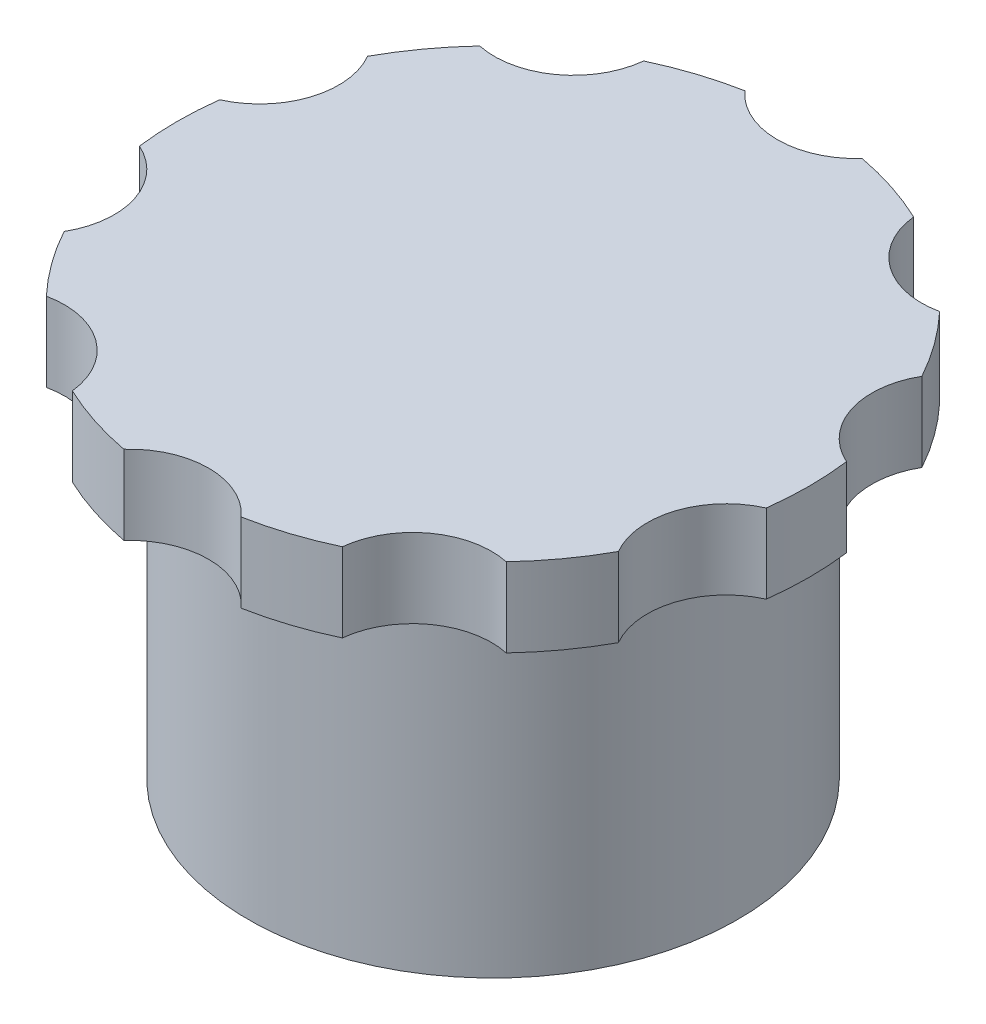
ISO-10303-21;
HEADER;
FILE_DESCRIPTION(('STEP AP214'),'2;1');
FILE_NAME('part.step','',(''),(''),'','','');
FILE_SCHEMA(('AUTOMOTIVE_DESIGN { 1 0 10303 214 1 1 1 1 }'));
ENDSEC;
DATA;
#1=APPLICATION_CONTEXT('core data for automotive mechanical design processes');
#2=APPLICATION_PROTOCOL_DEFINITION('international standard','automotive_design',2000,#1);
#3=PRODUCT_CONTEXT('',#1,'mechanical');
#4=PRODUCT('Part','Part','',(#3));
#5=PRODUCT_RELATED_PRODUCT_CATEGORY('part','',(#4));
#6=PRODUCT_DEFINITION_FORMATION('','',#4);
#7=PRODUCT_DEFINITION_CONTEXT('part definition',#1,'design');
#8=PRODUCT_DEFINITION('design','',#6,#7);
#9=PRODUCT_DEFINITION_SHAPE('','',#8);
#10=(LENGTH_UNIT() NAMED_UNIT(*) SI_UNIT(.MILLI.,.METRE.));
#11=(NAMED_UNIT(*) PLANE_ANGLE_UNIT() SI_UNIT($,.RADIAN.));
#12=(NAMED_UNIT(*) SI_UNIT($,.STERADIAN.) SOLID_ANGLE_UNIT());
#13=UNCERTAINTY_MEASURE_WITH_UNIT(LENGTH_MEASURE(1.E-05),#10,'distance_accuracy_value','');
#14=(GEOMETRIC_REPRESENTATION_CONTEXT(3) GLOBAL_UNCERTAINTY_ASSIGNED_CONTEXT((#13)) GLOBAL_UNIT_ASSIGNED_CONTEXT((#10,
#11,#12)) REPRESENTATION_CONTEXT('',''));
#15=CARTESIAN_POINT('',(0.,0.,0.));
#16=DIRECTION('',(0.,0.,1.));
#17=DIRECTION('',(1.,0.,0.));
#18=AXIS2_PLACEMENT_3D('',#15,#16,#17);
#19=CARTESIAN_POINT('',(0.,21.,0.));
#20=DIRECTION('',(0.,1.,0.));
#21=DIRECTION('',(0.,0.,1.));
#22=AXIS2_PLACEMENT_3D('',#19,#20,#21);
#23=PLANE('',#22);
#24=CARTESIAN_POINT('',(0.,21.,0.));
#25=DIRECTION('',(0.,1.,0.));
#26=DIRECTION('',(0.,0.,1.));
#27=AXIS2_PLACEMENT_3D('',#24,#25,#26);
#28=CIRCLE('',#27,15.5);
#29=CARTESIAN_POINT('',(0.,21.,-15.5));
#30=VERTEX_POINT('',#29);
#31=EDGE_CURVE('E230',#30,#30,#28,.T.);
#32=ORIENTED_EDGE('',*,*,#31,.T.);
#33=EDGE_LOOP('',(#32));
#34=FACE_BOUND('',#33,.T.);
#35=CARTESIAN_POINT('',(0.,21.,0.));
#36=DIRECTION('',(0.,1.,0.));
#37=DIRECTION('',(0.,0.,1.));
#38=AXIS2_PLACEMENT_3D('',#35,#36,#37);
#39=CIRCLE('',#38,20.);
#40=CARTESIAN_POINT('',(3.71376634854066,21.,19.652173913042));
#41=VERTEX_POINT('',#40);
#42=CARTESIAN_POINT('',(8.54675791246722,21.,18.0818397621945));
#43=VERTEX_POINT('',#42);
#44=EDGE_CURVE('E171',#41,#43,#39,.T.);
#45=ORIENTED_EDGE('',*,*,#44,.F.);
#46=CARTESIAN_POINT('',(0.,21.,23.));
#47=DIRECTION('',(0.,1.,0.));
#48=DIRECTION('',(0.,0.,1.));
#49=AXIS2_PLACEMENT_3D('',#46,#47,#48);
#50=CIRCLE('',#49,5.00000000000698);
#51=CARTESIAN_POINT('',(-3.71376634854066,21.,19.652173913042));
#52=VERTEX_POINT('',#51);
#53=EDGE_CURVE('E186',#41,#52,#50,.T.);
#54=ORIENTED_EDGE('',*,*,#53,.T.);
#55=CARTESIAN_POINT('',(-8.5467579124647,21.,18.0818397621957));
#56=VERTEX_POINT('',#55);
#57=EDGE_CURVE('E193',#56,#52,#39,.T.);
#58=ORIENTED_EDGE('',*,*,#57,.F.);
#59=CARTESIAN_POINT('',(-13.5190608027269,21.,18.6073908706238));
#60=DIRECTION('',(0.,1.,0.));
#61=DIRECTION('',(0.,0.,1.));
#62=AXIS2_PLACEMENT_3D('',#59,#60,#61);
#63=CIRCLE('',#62,5.00000000000796);
#64=CARTESIAN_POINT('',(-14.5557580906809,21.,13.7160455819299));
#65=VERTEX_POINT('',#64);
#66=EDGE_CURVE('E201',#56,#65,#63,.T.);
#67=ORIENTED_EDGE('',*,*,#66,.T.);
#68=CARTESIAN_POINT('',(-17.5427111445265,21.,9.60485740132067));
#69=VERTEX_POINT('',#68);
#70=EDGE_CURVE('E355',#69,#65,#39,.T.);
#71=ORIENTED_EDGE('',*,*,#70,.F.);
#72=CARTESIAN_POINT('',(-21.8742998747885,21.,7.10739087062379));
#73=DIRECTION('',(0.,1.,0.));
#74=DIRECTION('',(0.,0.,1.));
#75=AXIS2_PLACEMENT_3D('',#72,#73,#74);
#76=CIRCLE('',#75,5.00000000000838);
#77=CARTESIAN_POINT('',(-19.8379449742012,21.,2.5408540297631));
#78=VERTEX_POINT('',#77);
#79=EDGE_CURVE('E279',#69,#78,#76,.T.);
#80=ORIENTED_EDGE('',*,*,#79,.T.);
#81=CARTESIAN_POINT('',(-19.8379449742012,21.,-2.54085402976331));
#82=VERTEX_POINT('',#81);
#83=EDGE_CURVE('E268',#82,#78,#39,.T.);
#84=ORIENTED_EDGE('',*,*,#83,.F.);
#85=CARTESIAN_POINT('',(-21.8742998747885,21.,-7.10739087062379));
#86=DIRECTION('',(0.,1.,0.));
#87=DIRECTION('',(0.,0.,1.));
#88=AXIS2_PLACEMENT_3D('',#85,#86,#87);
#89=CIRCLE('',#88,5.00000000000819);
#90=CARTESIAN_POINT('',(-17.5427111445266,21.,-9.60485740132047));
#91=VERTEX_POINT('',#90);
#92=EDGE_CURVE('E266',#82,#91,#89,.T.);
#93=ORIENTED_EDGE('',*,*,#92,.T.);
#94=CARTESIAN_POINT('',(-14.5557580906807,21.,-13.7160455819301));
#95=VERTEX_POINT('',#94);
#96=EDGE_CURVE('E253',#95,#91,#39,.T.);
#97=ORIENTED_EDGE('',*,*,#96,.F.);
#98=CARTESIAN_POINT('',(-13.5190608027269,21.,-18.6073908706238));
#99=DIRECTION('',(0.,1.,0.));
#100=DIRECTION('',(0.,0.,1.));
#101=AXIS2_PLACEMENT_3D('',#98,#99,#100);
#102=CIRCLE('',#101,5.00000000000768);
#103=CARTESIAN_POINT('',(-8.54675791246501,21.,-18.0818397621956));
#104=VERTEX_POINT('',#103);
#105=EDGE_CURVE('E263',#95,#104,#102,.T.);
#106=ORIENTED_EDGE('',*,*,#105,.T.);
#107=CARTESIAN_POINT('',(-3.71376634853263,21.,-19.6521739130435));
#108=VERTEX_POINT('',#107);
#109=EDGE_CURVE('E267',#108,#104,#39,.T.);
#110=ORIENTED_EDGE('',*,*,#109,.F.);
#111=CARTESIAN_POINT('',(0.,21.,-23.));
#112=DIRECTION('',(0.,1.,0.));
#113=DIRECTION('',(0.,0.,1.));
#114=AXIS2_PLACEMENT_3D('',#111,#112,#113);
#115=CIRCLE('',#114,5.);
#116=CARTESIAN_POINT('',(3.71376634853263,21.,-19.6521739130435));
#117=VERTEX_POINT('',#116);
#118=EDGE_CURVE('E220',#108,#117,#115,.T.);
#119=ORIENTED_EDGE('',*,*,#118,.T.);
#120=CARTESIAN_POINT('',(8.54675791247195,21.,-18.0818397621923));
#121=VERTEX_POINT('',#120);
#122=EDGE_CURVE('E341',#121,#117,#39,.T.);
#123=ORIENTED_EDGE('',*,*,#122,.F.);
#124=CARTESIAN_POINT('',(13.5190608027269,21.,-18.6073908706238));
#125=DIRECTION('',(0.,1.,0.));
#126=DIRECTION('',(0.,0.,1.));
#127=AXIS2_PLACEMENT_3D('',#124,#125,#126);
#128=CIRCLE('',#127,5.00000000000111);
#129=CARTESIAN_POINT('',(14.5557580906754,21.,-13.7160455819357));
#130=VERTEX_POINT('',#129);
#131=EDGE_CURVE('E217',#121,#130,#128,.T.);
#132=ORIENTED_EDGE('',*,*,#131,.T.);
#133=CARTESIAN_POINT('',(17.5427111445299,21.,-9.60485740131454));
#134=VERTEX_POINT('',#133);
#135=EDGE_CURVE('E544',#134,#130,#39,.T.);
#136=ORIENTED_EDGE('',*,*,#135,.F.);
#137=CARTESIAN_POINT('',(21.8742998747885,21.,-7.10739087062379));
#138=DIRECTION('',(0.,1.,0.));
#139=DIRECTION('',(0.,0.,1.));
#140=AXIS2_PLACEMENT_3D('',#137,#138,#139);
#141=CIRCLE('',#140,5.00000000000241);
#142=CARTESIAN_POINT('',(19.8379449742004,21.,-2.54085402977003));
#143=VERTEX_POINT('',#142);
#144=EDGE_CURVE('E212',#134,#143,#141,.T.);
#145=ORIENTED_EDGE('',*,*,#144,.T.);
#146=CARTESIAN_POINT('',(19.8379449742006,21.,2.5408540297682));
#147=VERTEX_POINT('',#146);
#148=EDGE_CURVE('E548',#147,#143,#39,.T.);
#149=ORIENTED_EDGE('',*,*,#148,.F.);
#150=CARTESIAN_POINT('',(21.8742998747885,21.,7.10739087062379));
#151=DIRECTION('',(0.,1.,0.));
#152=DIRECTION('',(0.,0.,1.));
#153=AXIS2_PLACEMENT_3D('',#150,#151,#152);
#154=CIRCLE('',#153,5.00000000000398);
#155=CARTESIAN_POINT('',(17.542711144529,21.,9.60485740131615));
#156=VERTEX_POINT('',#155);
#157=EDGE_CURVE('E209',#147,#156,#154,.T.);
#158=ORIENTED_EDGE('',*,*,#157,.T.);
#159=CARTESIAN_POINT('',(14.555758090679,21.,13.7160455819319));
#160=VERTEX_POINT('',#159);
#161=EDGE_CURVE('E191',#160,#156,#39,.T.);
#162=ORIENTED_EDGE('',*,*,#161,.F.);
#163=CARTESIAN_POINT('',(13.5190608027269,21.,18.6073908706238));
#164=DIRECTION('',(0.,1.,0.));
#165=DIRECTION('',(0.,0.,1.));
#166=AXIS2_PLACEMENT_3D('',#163,#164,#165);
#167=CIRCLE('',#166,5.00000000000558);
#168=EDGE_CURVE('E189',#160,#43,#167,.T.);
#169=ORIENTED_EDGE('',*,*,#168,.T.);
#170=EDGE_LOOP('',(#45,#54,#58,#67,#71,#80,#84,#93,#97,#106,#110,#119,#123,#132,#136,#145,#149,
#158,#162,#169));
#171=FACE_BOUND('',#170,.T.);
#172=ADVANCED_FACE('F33',(#34,#171),#23,.F.);
#173=CARTESIAN_POINT('',(0.,26.,0.));
#174=DIRECTION('',(0.,1.,0.));
#175=DIRECTION('',(0.,0.,1.));
#176=AXIS2_PLACEMENT_3D('',#173,#174,#175);
#177=PLANE('',#176);
#178=CARTESIAN_POINT('',(0.,26.,23.));
#179=DIRECTION('',(0.,1.,0.));
#180=DIRECTION('',(0.,0.,1.));
#181=AXIS2_PLACEMENT_3D('',#178,#179,#180);
#182=CIRCLE('',#181,5.00000000000698);
#183=CARTESIAN_POINT('',(3.71376634854066,26.,19.652173913042));
#184=VERTEX_POINT('',#183);
#185=CARTESIAN_POINT('',(-3.71376634854066,26.,19.652173913042));
#186=VERTEX_POINT('',#185);
#187=EDGE_CURVE('E197',#184,#186,#182,.T.);
#188=ORIENTED_EDGE('',*,*,#187,.F.);
#189=CARTESIAN_POINT('',(0.,26.,0.));
#190=DIRECTION('',(0.,1.,0.));
#191=DIRECTION('',(0.,0.,1.));
#192=AXIS2_PLACEMENT_3D('',#189,#190,#191);
#193=CIRCLE('',#192,20.);
#194=CARTESIAN_POINT('',(8.54675791246722,26.,18.0818397621945));
#195=VERTEX_POINT('',#194);
#196=EDGE_CURVE('E174',#184,#195,#193,.T.);
#197=ORIENTED_EDGE('',*,*,#196,.T.);
#198=CARTESIAN_POINT('',(13.5190608027269,26.,18.6073908706238));
#199=DIRECTION('',(0.,1.,0.));
#200=DIRECTION('',(0.,0.,1.));
#201=AXIS2_PLACEMENT_3D('',#198,#199,#200);
#202=CIRCLE('',#201,5.00000000000558);
#203=CARTESIAN_POINT('',(14.555758090679,26.,13.7160455819319));
#204=VERTEX_POINT('',#203);
#205=EDGE_CURVE('E196',#204,#195,#202,.T.);
#206=ORIENTED_EDGE('',*,*,#205,.F.);
#207=CARTESIAN_POINT('',(17.542711144529,26.,9.60485740131615));
#208=VERTEX_POINT('',#207);
#209=EDGE_CURVE('E306',#204,#208,#193,.T.);
#210=ORIENTED_EDGE('',*,*,#209,.T.);
#211=CARTESIAN_POINT('',(21.8742998747885,26.,7.10739087062379));
#212=DIRECTION('',(0.,1.,0.));
#213=DIRECTION('',(0.,0.,1.));
#214=AXIS2_PLACEMENT_3D('',#211,#212,#213);
#215=CIRCLE('',#214,5.00000000000398);
#216=CARTESIAN_POINT('',(19.8379449742006,26.,2.54085402976821));
#217=VERTEX_POINT('',#216);
#218=EDGE_CURVE('E207',#217,#208,#215,.T.);
#219=ORIENTED_EDGE('',*,*,#218,.F.);
#220=CARTESIAN_POINT('',(19.8379449742004,26.,-2.54085402977003));
#221=VERTEX_POINT('',#220);
#222=EDGE_CURVE('E346',#217,#221,#193,.T.);
#223=ORIENTED_EDGE('',*,*,#222,.T.);
#224=CARTESIAN_POINT('',(21.8742998747885,26.,-7.10739087062379));
#225=DIRECTION('',(0.,1.,0.));
#226=DIRECTION('',(0.,0.,1.));
#227=AXIS2_PLACEMENT_3D('',#224,#225,#226);
#228=CIRCLE('',#227,5.00000000000241);
#229=CARTESIAN_POINT('',(17.5427111445299,26.,-9.60485740131453));
#230=VERTEX_POINT('',#229);
#231=EDGE_CURVE('E241',#230,#221,#228,.T.);
#232=ORIENTED_EDGE('',*,*,#231,.F.);
#233=CARTESIAN_POINT('',(14.5557580906754,26.,-13.7160455819357));
#234=VERTEX_POINT('',#233);
#235=EDGE_CURVE('E56',#230,#234,#193,.T.);
#236=ORIENTED_EDGE('',*,*,#235,.T.);
#237=CARTESIAN_POINT('',(13.5190608027269,26.,-18.6073908706238));
#238=DIRECTION('',(0.,1.,0.));
#239=DIRECTION('',(0.,0.,1.));
#240=AXIS2_PLACEMENT_3D('',#237,#238,#239);
#241=CIRCLE('',#240,5.00000000000111);
#242=CARTESIAN_POINT('',(8.54675791247195,26.,-18.0818397621923));
#243=VERTEX_POINT('',#242);
#244=EDGE_CURVE('E238',#243,#234,#241,.T.);
#245=ORIENTED_EDGE('',*,*,#244,.F.);
#246=CARTESIAN_POINT('',(3.71376634853263,26.,-19.6521739130435));
#247=VERTEX_POINT('',#246);
#248=EDGE_CURVE('E48',#243,#247,#193,.T.);
#249=ORIENTED_EDGE('',*,*,#248,.T.);
#250=CARTESIAN_POINT('',(0.,26.,-23.));
#251=DIRECTION('',(0.,1.,0.));
#252=DIRECTION('',(0.,0.,1.));
#253=AXIS2_PLACEMENT_3D('',#250,#251,#252);
#254=CIRCLE('',#253,5.);
#255=CARTESIAN_POINT('',(-3.71376634853263,26.,-19.6521739130435));
#256=VERTEX_POINT('',#255);
#257=EDGE_CURVE('E233',#256,#247,#254,.T.);
#258=ORIENTED_EDGE('',*,*,#257,.F.);
#259=CARTESIAN_POINT('',(-8.54675791246501,26.,-18.0818397621956));
#260=VERTEX_POINT('',#259);
#261=EDGE_CURVE('E336',#256,#260,#193,.T.);
#262=ORIENTED_EDGE('',*,*,#261,.T.);
#263=CARTESIAN_POINT('',(-13.5190608027269,26.,-18.6073908706238));
#264=DIRECTION('',(0.,1.,0.));
#265=DIRECTION('',(0.,0.,1.));
#266=AXIS2_PLACEMENT_3D('',#263,#264,#265);
#267=CIRCLE('',#266,5.00000000000768);
#268=CARTESIAN_POINT('',(-14.5557580906807,26.,-13.7160455819301));
#269=VERTEX_POINT('',#268);
#270=EDGE_CURVE('E247',#269,#260,#267,.T.);
#271=ORIENTED_EDGE('',*,*,#270,.F.);
#272=CARTESIAN_POINT('',(-17.5427111445266,26.,-9.60485740132047));
#273=VERTEX_POINT('',#272);
#274=EDGE_CURVE('E256',#269,#273,#193,.T.);
#275=ORIENTED_EDGE('',*,*,#274,.T.);
#276=CARTESIAN_POINT('',(-21.8742998747885,26.,-7.10739087062379));
#277=DIRECTION('',(0.,1.,0.));
#278=DIRECTION('',(0.,0.,1.));
#279=AXIS2_PLACEMENT_3D('',#276,#277,#278);
#280=CIRCLE('',#279,5.00000000000819);
#281=CARTESIAN_POINT('',(-19.8379449742012,26.,-2.54085402976331));
#282=VERTEX_POINT('',#281);
#283=EDGE_CURVE('E244',#282,#273,#280,.T.);
#284=ORIENTED_EDGE('',*,*,#283,.F.);
#285=CARTESIAN_POINT('',(-19.8379449742012,26.,2.5408540297631));
#286=VERTEX_POINT('',#285);
#287=EDGE_CURVE('E303',#282,#286,#193,.T.);
#288=ORIENTED_EDGE('',*,*,#287,.T.);
#289=CARTESIAN_POINT('',(-21.8742998747885,26.,7.10739087062379));
#290=DIRECTION('',(0.,1.,0.));
#291=DIRECTION('',(0.,0.,1.));
#292=AXIS2_PLACEMENT_3D('',#289,#290,#291);
#293=CIRCLE('',#292,5.00000000000838);
#294=CARTESIAN_POINT('',(-17.5427111445265,26.,9.60485740132067));
#295=VERTEX_POINT('',#294);
#296=EDGE_CURVE('E273',#295,#286,#293,.T.);
#297=ORIENTED_EDGE('',*,*,#296,.F.);
#298=CARTESIAN_POINT('',(-14.5557580906809,26.,13.7160455819299));
#299=VERTEX_POINT('',#298);
#300=EDGE_CURVE('E299',#295,#299,#193,.T.);
#301=ORIENTED_EDGE('',*,*,#300,.T.);
#302=CARTESIAN_POINT('',(-13.5190608027269,26.,18.6073908706238));
#303=DIRECTION('',(0.,1.,0.));
#304=DIRECTION('',(0.,0.,1.));
#305=AXIS2_PLACEMENT_3D('',#302,#303,#304);
#306=CIRCLE('',#305,5.00000000000796);
#307=CARTESIAN_POINT('',(-8.5467579124647,26.,18.0818397621957));
#308=VERTEX_POINT('',#307);
#309=EDGE_CURVE('E204',#308,#299,#306,.T.);
#310=ORIENTED_EDGE('',*,*,#309,.F.);
#311=EDGE_CURVE('E297',#308,#186,#193,.T.);
#312=ORIENTED_EDGE('',*,*,#311,.T.);
#313=EDGE_LOOP('',(#188,#197,#206,#210,#219,#223,#232,#236,#245,#249,#258,#262,#271,#275,#284,
#288,#297,#301,#310,#312));
#314=FACE_BOUND('',#313,.T.);
#315=ADVANCED_FACE('F296',(#314),#177,.T.);
#316=CARTESIAN_POINT('',(0.,21.,-23.));
#317=DIRECTION('',(0.,1.,0.));
#318=DIRECTION('',(0.,0.,1.));
#319=AXIS2_PLACEMENT_3D('',#316,#317,#318);
#320=CYLINDRICAL_SURFACE('',#319,5.);
#321=DIRECTION('',(0.,1.,0.));
#322=VECTOR('',#321,1.);
#323=CARTESIAN_POINT('',(3.71376634853263,23.5,-19.6521739130435));
#324=LINE('',#323,#322);
#325=EDGE_CURVE('E271',#117,#247,#324,.T.);
#326=ORIENTED_EDGE('',*,*,#325,.F.);
#327=ORIENTED_EDGE('',*,*,#118,.F.);
#328=DIRECTION('',(0.,1.,0.));
#329=VECTOR('',#328,1.);
#330=CARTESIAN_POINT('',(-3.71376634853263,23.5,-19.6521739130435));
#331=LINE('',#330,#329);
#332=EDGE_CURVE('E275',#256,#108,#331,.F.);
#333=ORIENTED_EDGE('',*,*,#332,.F.);
#334=ORIENTED_EDGE('',*,*,#257,.T.);
#335=EDGE_LOOP('',(#326,#327,#333,#334));
#336=FACE_BOUND('',#335,.T.);
#337=ADVANCED_FACE('F343',(#336),#320,.F.);
#338=CARTESIAN_POINT('',(13.5190608027269,21.,-18.6073908706238));
#339=DIRECTION('',(0.,1.,0.));
#340=DIRECTION('',(0.,0.,1.));
#341=AXIS2_PLACEMENT_3D('',#338,#339,#340);
#342=CYLINDRICAL_SURFACE('',#341,5.00000000000111);
#343=DIRECTION('',(0.,1.,0.));
#344=VECTOR('',#343,1.);
#345=CARTESIAN_POINT('',(14.5557580906754,23.5,-13.7160455819357));
#346=LINE('',#345,#344);
#347=EDGE_CURVE('E331',#130,#234,#346,.T.);
#348=ORIENTED_EDGE('',*,*,#347,.F.);
#349=ORIENTED_EDGE('',*,*,#131,.F.);
#350=DIRECTION('',(0.,1.,0.));
#351=VECTOR('',#350,1.);
#352=CARTESIAN_POINT('',(8.54675791247195,23.5,-18.0818397621923));
#353=LINE('',#352,#351);
#354=EDGE_CURVE('E329',#243,#121,#353,.F.);
#355=ORIENTED_EDGE('',*,*,#354,.F.);
#356=ORIENTED_EDGE('',*,*,#244,.T.);
#357=EDGE_LOOP('',(#348,#349,#355,#356));
#358=FACE_BOUND('',#357,.T.);
#359=ADVANCED_FACE('F422',(#358),#342,.F.);
#360=CARTESIAN_POINT('',(21.8742998747885,21.,-7.10739087062379));
#361=DIRECTION('',(0.,1.,0.));
#362=DIRECTION('',(0.,0.,1.));
#363=AXIS2_PLACEMENT_3D('',#360,#361,#362);
#364=CYLINDRICAL_SURFACE('',#363,5.00000000000241);
#365=DIRECTION('',(0.,1.,0.));
#366=VECTOR('',#365,1.);
#367=CARTESIAN_POINT('',(19.8379449742004,23.5,-2.54085402977003));
#368=LINE('',#367,#366);
#369=EDGE_CURVE('E327',#143,#221,#368,.T.);
#370=ORIENTED_EDGE('',*,*,#369,.F.);
#371=ORIENTED_EDGE('',*,*,#144,.F.);
#372=DIRECTION('',(0.,1.,0.));
#373=VECTOR('',#372,1.);
#374=CARTESIAN_POINT('',(17.5427111445299,23.5,-9.60485740131454));
#375=LINE('',#374,#373);
#376=EDGE_CURVE('E325',#230,#134,#375,.F.);
#377=ORIENTED_EDGE('',*,*,#376,.F.);
#378=ORIENTED_EDGE('',*,*,#231,.T.);
#379=EDGE_LOOP('',(#370,#371,#377,#378));
#380=FACE_BOUND('',#379,.T.);
#381=ADVANCED_FACE('F418',(#380),#364,.F.);
#382=CARTESIAN_POINT('',(21.8742998747885,21.,7.10739087062379));
#383=DIRECTION('',(0.,1.,0.));
#384=DIRECTION('',(0.,0.,1.));
#385=AXIS2_PLACEMENT_3D('',#382,#383,#384);
#386=CYLINDRICAL_SURFACE('',#385,5.00000000000398);
#387=DIRECTION('',(0.,1.,0.));
#388=VECTOR('',#387,1.);
#389=CARTESIAN_POINT('',(17.542711144529,23.5,9.60485740131615));
#390=LINE('',#389,#388);
#391=EDGE_CURVE('E323',#156,#208,#390,.T.);
#392=ORIENTED_EDGE('',*,*,#391,.F.);
#393=ORIENTED_EDGE('',*,*,#157,.F.);
#394=DIRECTION('',(0.,1.,0.));
#395=VECTOR('',#394,1.);
#396=CARTESIAN_POINT('',(19.8379449742006,23.5,2.5408540297682));
#397=LINE('',#396,#395);
#398=EDGE_CURVE('E321',#217,#147,#397,.F.);
#399=ORIENTED_EDGE('',*,*,#398,.F.);
#400=ORIENTED_EDGE('',*,*,#218,.T.);
#401=EDGE_LOOP('',(#392,#393,#399,#400));
#402=FACE_BOUND('',#401,.T.);
#403=ADVANCED_FACE('F414',(#402),#386,.F.);
#404=CARTESIAN_POINT('',(13.5190608027269,21.,18.6073908706238));
#405=DIRECTION('',(0.,1.,0.));
#406=DIRECTION('',(0.,0.,1.));
#407=AXIS2_PLACEMENT_3D('',#404,#405,#406);
#408=CYLINDRICAL_SURFACE('',#407,5.00000000000558);
#409=DIRECTION('',(0.,1.,0.));
#410=VECTOR('',#409,1.);
#411=CARTESIAN_POINT('',(8.54675791246722,23.5,18.0818397621945));
#412=LINE('',#411,#410);
#413=EDGE_CURVE('E319',#43,#195,#412,.T.);
#414=ORIENTED_EDGE('',*,*,#413,.F.);
#415=ORIENTED_EDGE('',*,*,#168,.F.);
#416=DIRECTION('',(0.,1.,0.));
#417=VECTOR('',#416,1.);
#418=CARTESIAN_POINT('',(14.555758090679,23.5,13.7160455819319));
#419=LINE('',#418,#417);
#420=EDGE_CURVE('E317',#204,#160,#419,.F.);
#421=ORIENTED_EDGE('',*,*,#420,.F.);
#422=ORIENTED_EDGE('',*,*,#205,.T.);
#423=EDGE_LOOP('',(#414,#415,#421,#422));
#424=FACE_BOUND('',#423,.T.);
#425=ADVANCED_FACE('F411',(#424),#408,.F.);
#426=CARTESIAN_POINT('',(0.,21.,23.));
#427=DIRECTION('',(0.,1.,0.));
#428=DIRECTION('',(0.,0.,1.));
#429=AXIS2_PLACEMENT_3D('',#426,#427,#428);
#430=CYLINDRICAL_SURFACE('',#429,5.00000000000698);
#431=DIRECTION('',(0.,1.,0.));
#432=VECTOR('',#431,1.);
#433=CARTESIAN_POINT('',(-3.71376634854066,23.5,19.652173913042));
#434=LINE('',#433,#432);
#435=EDGE_CURVE('E179',#52,#186,#434,.T.);
#436=ORIENTED_EDGE('',*,*,#435,.F.);
#437=ORIENTED_EDGE('',*,*,#53,.F.);
#438=DIRECTION('',(0.,1.,0.));
#439=VECTOR('',#438,1.);
#440=CARTESIAN_POINT('',(3.71376634854066,23.5,19.652173913042));
#441=LINE('',#440,#439);
#442=EDGE_CURVE('E168',#184,#41,#441,.F.);
#443=ORIENTED_EDGE('',*,*,#442,.F.);
#444=ORIENTED_EDGE('',*,*,#187,.T.);
#445=EDGE_LOOP('',(#436,#437,#443,#444));
#446=FACE_BOUND('',#445,.T.);
#447=ADVANCED_FACE('F195',(#446),#430,.F.);
#448=CARTESIAN_POINT('',(-13.5190608027269,21.,18.6073908706238));
#449=DIRECTION('',(0.,1.,0.));
#450=DIRECTION('',(0.,0.,1.));
#451=AXIS2_PLACEMENT_3D('',#448,#449,#450);
#452=CYLINDRICAL_SURFACE('',#451,5.00000000000796);
#453=DIRECTION('',(0.,1.,0.));
#454=VECTOR('',#453,1.);
#455=CARTESIAN_POINT('',(-14.5557580906809,23.5,13.7160455819299));
#456=LINE('',#455,#454);
#457=EDGE_CURVE('E180',#65,#299,#456,.T.);
#458=ORIENTED_EDGE('',*,*,#457,.F.);
#459=ORIENTED_EDGE('',*,*,#66,.F.);
#460=DIRECTION('',(0.,1.,0.));
#461=VECTOR('',#460,1.);
#462=CARTESIAN_POINT('',(-8.5467579124647,23.5,18.0818397621957));
#463=LINE('',#462,#461);
#464=EDGE_CURVE('E292',#308,#56,#463,.F.);
#465=ORIENTED_EDGE('',*,*,#464,.F.);
#466=ORIENTED_EDGE('',*,*,#309,.T.);
#467=EDGE_LOOP('',(#458,#459,#465,#466));
#468=FACE_BOUND('',#467,.T.);
#469=ADVANCED_FACE('F291',(#468),#452,.F.);
#470=CARTESIAN_POINT('',(-21.8742998747885,21.,7.10739087062379));
#471=DIRECTION('',(0.,1.,0.));
#472=DIRECTION('',(0.,0.,1.));
#473=AXIS2_PLACEMENT_3D('',#470,#471,#472);
#474=CYLINDRICAL_SURFACE('',#473,5.00000000000838);
#475=DIRECTION('',(0.,1.,0.));
#476=VECTOR('',#475,1.);
#477=CARTESIAN_POINT('',(-19.8379449742012,23.5,2.5408540297631));
#478=LINE('',#477,#476);
#479=EDGE_CURVE('E312',#78,#286,#478,.T.);
#480=ORIENTED_EDGE('',*,*,#479,.F.);
#481=ORIENTED_EDGE('',*,*,#79,.F.);
#482=DIRECTION('',(0.,1.,0.));
#483=VECTOR('',#482,1.);
#484=CARTESIAN_POINT('',(-17.5427111445265,23.5,9.60485740132067));
#485=LINE('',#484,#483);
#486=EDGE_CURVE('E310',#295,#69,#485,.F.);
#487=ORIENTED_EDGE('',*,*,#486,.F.);
#488=ORIENTED_EDGE('',*,*,#296,.T.);
#489=EDGE_LOOP('',(#480,#481,#487,#488));
#490=FACE_BOUND('',#489,.T.);
#491=ADVANCED_FACE('F401',(#490),#474,.F.);
#492=CARTESIAN_POINT('',(-21.8742998747885,21.,-7.10739087062379));
#493=DIRECTION('',(0.,1.,0.));
#494=DIRECTION('',(0.,0.,1.));
#495=AXIS2_PLACEMENT_3D('',#492,#493,#494);
#496=CYLINDRICAL_SURFACE('',#495,5.00000000000819);
#497=DIRECTION('',(0.,1.,0.));
#498=VECTOR('',#497,1.);
#499=CARTESIAN_POINT('',(-17.5427111445266,23.5,-9.60485740132047));
#500=LINE('',#499,#498);
#501=EDGE_CURVE('E308',#91,#273,#500,.T.);
#502=ORIENTED_EDGE('',*,*,#501,.F.);
#503=ORIENTED_EDGE('',*,*,#92,.F.);
#504=DIRECTION('',(0.,1.,0.));
#505=VECTOR('',#504,1.);
#506=CARTESIAN_POINT('',(-19.8379449742012,23.5,-2.54085402976331));
#507=LINE('',#506,#505);
#508=EDGE_CURVE('E190',#282,#82,#507,.F.);
#509=ORIENTED_EDGE('',*,*,#508,.F.);
#510=ORIENTED_EDGE('',*,*,#283,.T.);
#511=EDGE_LOOP('',(#502,#503,#509,#510));
#512=FACE_BOUND('',#511,.T.);
#513=ADVANCED_FACE('F350',(#512),#496,.F.);
#514=CARTESIAN_POINT('',(-13.5190608027269,21.,-18.6073908706238));
#515=DIRECTION('',(0.,1.,0.));
#516=DIRECTION('',(0.,0.,1.));
#517=AXIS2_PLACEMENT_3D('',#514,#515,#516);
#518=CYLINDRICAL_SURFACE('',#517,5.00000000000768);
#519=DIRECTION('',(0.,1.,0.));
#520=VECTOR('',#519,1.);
#521=CARTESIAN_POINT('',(-8.54675791246501,23.5,-18.0818397621956));
#522=LINE('',#521,#520);
#523=EDGE_CURVE('E11',#104,#260,#522,.T.);
#524=ORIENTED_EDGE('',*,*,#523,.F.);
#525=ORIENTED_EDGE('',*,*,#105,.F.);
#526=DIRECTION('',(0.,1.,0.));
#527=VECTOR('',#526,1.);
#528=CARTESIAN_POINT('',(-14.5557580906807,23.5,-13.7160455819301));
#529=LINE('',#528,#527);
#530=EDGE_CURVE('E41',#269,#95,#529,.F.);
#531=ORIENTED_EDGE('',*,*,#530,.F.);
#532=ORIENTED_EDGE('',*,*,#270,.T.);
#533=EDGE_LOOP('',(#524,#525,#531,#532));
#534=FACE_BOUND('',#533,.T.);
#535=ADVANCED_FACE('F270',(#534),#518,.F.);
#536=CARTESIAN_POINT('',(0.,0.,0.));
#537=DIRECTION('',(0.,1.,0.));
#538=DIRECTION('',(0.,0.,1.));
#539=AXIS2_PLACEMENT_3D('',#536,#537,#538);
#540=PLANE('',#539);
#541=CARTESIAN_POINT('',(0.,0.,0.));
#542=DIRECTION('',(0.,1.,0.));
#543=DIRECTION('',(0.,0.,1.));
#544=AXIS2_PLACEMENT_3D('',#541,#542,#543);
#545=CIRCLE('',#544,15.5);
#546=CARTESIAN_POINT('',(0.,0.,-15.5));
#547=VERTEX_POINT('',#546);
#548=EDGE_CURVE('E229',#547,#547,#545,.T.);
#549=ORIENTED_EDGE('',*,*,#548,.F.);
#550=EDGE_LOOP('',(#549));
#551=FACE_BOUND('',#550,.T.);
#552=CARTESIAN_POINT('',(0.,0.,0.));
#553=DIRECTION('',(0.,1.,0.));
#554=DIRECTION('',(0.,0.,1.));
#555=AXIS2_PLACEMENT_3D('',#552,#553,#554);
#556=CIRCLE('',#555,10.);
#557=CARTESIAN_POINT('',(0.,0.,-10.));
#558=VERTEX_POINT('',#557);
#559=EDGE_CURVE('E226',#558,#558,#556,.T.);
#560=ORIENTED_EDGE('',*,*,#559,.T.);
#561=EDGE_LOOP('',(#560));
#562=FACE_BOUND('',#561,.T.);
#563=ADVANCED_FACE('F388',(#551,#562),#540,.F.);
#564=CARTESIAN_POINT('',(0.,21.,0.));
#565=DIRECTION('',(0.,-1.,0.));
#566=DIRECTION('',(0.,0.,-1.));
#567=AXIS2_PLACEMENT_3D('',#564,#565,#566);
#568=CYLINDRICAL_SURFACE('',#567,15.5);
#569=CARTESIAN_POINT('',(0.,21.,-15.5));
#570=CARTESIAN_POINT('',(0.,20.78125,-15.5));
#571=CARTESIAN_POINT('',(0.,20.5625,-15.5));
#572=CARTESIAN_POINT('',(0.,20.125,-15.5));
#573=CARTESIAN_POINT('',(0.,19.90625,-15.5));
#574=CARTESIAN_POINT('',(0.,19.46875,-15.5));
#575=CARTESIAN_POINT('',(0.,19.25,-15.5));
#576=CARTESIAN_POINT('',(0.,18.8125,-15.5));
#577=CARTESIAN_POINT('',(0.,18.59375,-15.5));
#578=CARTESIAN_POINT('',(0.,18.15625,-15.5));
#579=CARTESIAN_POINT('',(0.,17.9375,-15.5));
#580=CARTESIAN_POINT('',(0.,17.5,-15.5));
#581=CARTESIAN_POINT('',(0.,17.28125,-15.5));
#582=CARTESIAN_POINT('',(0.,16.84375,-15.5));
#583=CARTESIAN_POINT('',(0.,16.625,-15.5));
#584=CARTESIAN_POINT('',(0.,16.1875,-15.5));
#585=CARTESIAN_POINT('',(0.,15.96875,-15.5));
#586=CARTESIAN_POINT('',(0.,15.53125,-15.5));
#587=CARTESIAN_POINT('',(0.,15.3125,-15.5));
#588=CARTESIAN_POINT('',(0.,14.875,-15.5));
#589=CARTESIAN_POINT('',(0.,14.65625,-15.5));
#590=CARTESIAN_POINT('',(0.,14.21875,-15.5));
#591=CARTESIAN_POINT('',(0.,14.,-15.5));
#592=CARTESIAN_POINT('',(0.,13.5625,-15.5));
#593=CARTESIAN_POINT('',(0.,13.34375,-15.5));
#594=CARTESIAN_POINT('',(0.,12.90625,-15.5));
#595=CARTESIAN_POINT('',(0.,12.6875,-15.5));
#596=CARTESIAN_POINT('',(0.,12.25,-15.5));
#597=CARTESIAN_POINT('',(0.,12.03125,-15.5));
#598=CARTESIAN_POINT('',(0.,11.59375,-15.5));
#599=CARTESIAN_POINT('',(0.,11.375,-15.5));
#600=CARTESIAN_POINT('',(0.,10.9375,-15.5));
#601=CARTESIAN_POINT('',(0.,10.71875,-15.5));
#602=CARTESIAN_POINT('',(0.,10.28125,-15.5));
#603=CARTESIAN_POINT('',(0.,10.0625,-15.5));
#604=CARTESIAN_POINT('',(0.,9.625,-15.5));
#605=CARTESIAN_POINT('',(0.,9.40625,-15.5));
#606=CARTESIAN_POINT('',(0.,8.96875,-15.5));
#607=CARTESIAN_POINT('',(0.,8.75,-15.5));
#608=CARTESIAN_POINT('',(0.,8.3125,-15.5));
#609=CARTESIAN_POINT('',(0.,8.09375,-15.5));
#610=CARTESIAN_POINT('',(0.,7.65625,-15.5));
#611=CARTESIAN_POINT('',(0.,7.4375,-15.5));
#612=CARTESIAN_POINT('',(0.,7.,-15.5));
#613=CARTESIAN_POINT('',(0.,6.78125,-15.5));
#614=CARTESIAN_POINT('',(0.,6.34375,-15.5));
#615=CARTESIAN_POINT('',(0.,6.125,-15.5));
#616=CARTESIAN_POINT('',(0.,5.6875,-15.5));
#617=CARTESIAN_POINT('',(0.,5.46875,-15.5));
#618=CARTESIAN_POINT('',(0.,5.03125,-15.5));
#619=CARTESIAN_POINT('',(0.,4.8125,-15.5));
#620=CARTESIAN_POINT('',(0.,4.375,-15.5));
#621=CARTESIAN_POINT('',(0.,4.15625,-15.5));
#622=CARTESIAN_POINT('',(0.,3.71875,-15.5));
#623=CARTESIAN_POINT('',(0.,3.5,-15.5));
#624=CARTESIAN_POINT('',(0.,3.0625,-15.5));
#625=CARTESIAN_POINT('',(0.,2.84375,-15.5));
#626=CARTESIAN_POINT('',(0.,2.40625,-15.5));
#627=CARTESIAN_POINT('',(0.,2.1875,-15.5));
#628=CARTESIAN_POINT('',(0.,1.75,-15.5));
#629=CARTESIAN_POINT('',(0.,1.53125,-15.5));
#630=CARTESIAN_POINT('',(0.,1.09375,-15.5));
#631=CARTESIAN_POINT('',(0.,0.875000000000001,-15.5));
#632=CARTESIAN_POINT('',(0.,0.4375,-15.5));
#633=CARTESIAN_POINT('',(0.,0.21875,-15.5));
#634=CARTESIAN_POINT('',(0.,0.,-15.5));
#635=B_SPLINE_CURVE_WITH_KNOTS('',3,(#569,#570,#571,#572,#573,#574,#575,#576,#577,#578,#579,
#580,#581,#582,#583,#584,#585,#586,#587,#588,#589,#590,#591,#592,#593,#594,#595,#596,#597,#598,
#599,#600,#601,#602,#603,#604,#605,#606,#607,#608,#609,#610,#611,#612,#613,#614,#615,#616,#617,
#618,#619,#620,#621,#622,#623,#624,#625,#626,#627,#628,#629,#630,#631,#632,#633,#634),
.UNSPECIFIED.,.F.,.F.,(4,2,2,2,2,2,2,2,2,2,2,2,2,2,2,2,2,2,2,2,2,2,2,2,2,2,2,2,2,2,2,2,4),(0.,
0.656250000000001,1.3125,1.96875,2.625,3.28125,3.9375,4.59375,5.25,5.90625,6.5625,7.21875,7.875,
8.53125,9.1875,9.84375,10.5,11.15625,11.8125,12.46875,13.125,13.78125,14.4375,15.09375,15.75,
16.40625,17.0625,17.71875,18.375,19.03125,19.6875,20.34375,21.),.UNSPECIFIED.);
#636=EDGE_CURVE('BSEAM35',#30,#547,#635,.T.);
#637=ORIENTED_EDGE('',*,*,#31,.F.);
#638=ORIENTED_EDGE('',*,*,#548,.T.);
#639=ORIENTED_EDGE('',*,*,#636,.T.);
#640=ORIENTED_EDGE('',*,*,#636,.F.);
#641=EDGE_LOOP('',(#637,#639,#638,#640));
#642=FACE_BOUND('',#641,.T.);
#643=ADVANCED_FACE('F35',(#642),#568,.T.);
#644=CARTESIAN_POINT('',(0.,21.,0.));
#645=DIRECTION('',(0.,-1.,0.));
#646=DIRECTION('',(0.,0.,-1.));
#647=AXIS2_PLACEMENT_3D('',#644,#645,#646);
#648=CYLINDRICAL_SURFACE('',#647,10.);
#649=CARTESIAN_POINT('',(0.,21.,0.));
#650=DIRECTION('',(0.,1.,0.));
#651=DIRECTION('',(0.,0.,1.));
#652=AXIS2_PLACEMENT_3D('',#649,#650,#651);
#653=CIRCLE('',#652,10.);
#654=CARTESIAN_POINT('',(0.,21.,-10.));
#655=VERTEX_POINT('',#654);
#656=EDGE_CURVE('E223',#655,#655,#653,.T.);
#657=CARTESIAN_POINT('',(0.,21.,-10.));
#658=CARTESIAN_POINT('',(0.,20.78125,-10.));
#659=CARTESIAN_POINT('',(0.,20.5625,-10.));
#660=CARTESIAN_POINT('',(0.,20.125,-10.));
#661=CARTESIAN_POINT('',(0.,19.90625,-10.));
#662=CARTESIAN_POINT('',(0.,19.46875,-10.));
#663=CARTESIAN_POINT('',(0.,19.25,-10.));
#664=CARTESIAN_POINT('',(0.,18.8125,-10.));
#665=CARTESIAN_POINT('',(0.,18.59375,-10.));
#666=CARTESIAN_POINT('',(0.,18.15625,-10.));
#667=CARTESIAN_POINT('',(0.,17.9375,-10.));
#668=CARTESIAN_POINT('',(0.,17.5,-10.));
#669=CARTESIAN_POINT('',(0.,17.28125,-10.));
#670=CARTESIAN_POINT('',(0.,16.84375,-10.));
#671=CARTESIAN_POINT('',(0.,16.625,-10.));
#672=CARTESIAN_POINT('',(0.,16.1875,-10.));
#673=CARTESIAN_POINT('',(0.,15.96875,-10.));
#674=CARTESIAN_POINT('',(0.,15.53125,-10.));
#675=CARTESIAN_POINT('',(0.,15.3125,-10.));
#676=CARTESIAN_POINT('',(0.,14.875,-10.));
#677=CARTESIAN_POINT('',(0.,14.65625,-10.));
#678=CARTESIAN_POINT('',(0.,14.21875,-10.));
#679=CARTESIAN_POINT('',(0.,14.,-10.));
#680=CARTESIAN_POINT('',(0.,13.5625,-10.));
#681=CARTESIAN_POINT('',(0.,13.34375,-10.));
#682=CARTESIAN_POINT('',(0.,12.90625,-10.));
#683=CARTESIAN_POINT('',(0.,12.6875,-10.));
#684=CARTESIAN_POINT('',(0.,12.25,-10.));
#685=CARTESIAN_POINT('',(0.,12.03125,-10.));
#686=CARTESIAN_POINT('',(0.,11.59375,-10.));
#687=CARTESIAN_POINT('',(0.,11.375,-10.));
#688=CARTESIAN_POINT('',(0.,10.9375,-10.));
#689=CARTESIAN_POINT('',(0.,10.71875,-10.));
#690=CARTESIAN_POINT('',(0.,10.28125,-10.));
#691=CARTESIAN_POINT('',(0.,10.0625,-10.));
#692=CARTESIAN_POINT('',(0.,9.625,-10.));
#693=CARTESIAN_POINT('',(0.,9.40625,-10.));
#694=CARTESIAN_POINT('',(0.,8.96875,-10.));
#695=CARTESIAN_POINT('',(0.,8.75,-10.));
#696=CARTESIAN_POINT('',(0.,8.3125,-10.));
#697=CARTESIAN_POINT('',(0.,8.09375,-10.));
#698=CARTESIAN_POINT('',(0.,7.65625,-10.));
#699=CARTESIAN_POINT('',(0.,7.4375,-10.));
#700=CARTESIAN_POINT('',(0.,7.,-10.));
#701=CARTESIAN_POINT('',(0.,6.78125,-10.));
#702=CARTESIAN_POINT('',(0.,6.34375,-10.));
#703=CARTESIAN_POINT('',(0.,6.125,-10.));
#704=CARTESIAN_POINT('',(0.,5.6875,-10.));
#705=CARTESIAN_POINT('',(0.,5.46875,-10.));
#706=CARTESIAN_POINT('',(0.,5.03125,-10.));
#707=CARTESIAN_POINT('',(0.,4.8125,-10.));
#708=CARTESIAN_POINT('',(0.,4.375,-10.));
#709=CARTESIAN_POINT('',(0.,4.15625,-10.));
#710=CARTESIAN_POINT('',(0.,3.71875,-10.));
#711=CARTESIAN_POINT('',(0.,3.5,-10.));
#712=CARTESIAN_POINT('',(0.,3.0625,-10.));
#713=CARTESIAN_POINT('',(0.,2.84375,-10.));
#714=CARTESIAN_POINT('',(0.,2.40625,-10.));
#715=CARTESIAN_POINT('',(0.,2.1875,-10.));
#716=CARTESIAN_POINT('',(0.,1.75,-10.));
#717=CARTESIAN_POINT('',(0.,1.53125,-10.));
#718=CARTESIAN_POINT('',(0.,1.09375,-10.));
#719=CARTESIAN_POINT('',(0.,0.875000000000001,-10.));
#720=CARTESIAN_POINT('',(0.,0.4375,-10.));
#721=CARTESIAN_POINT('',(0.,0.21875,-10.));
#722=CARTESIAN_POINT('',(0.,0.,-10.));
#723=B_SPLINE_CURVE_WITH_KNOTS('',3,(#657,#658,#659,#660,#661,#662,#663,#664,#665,#666,#667,
#668,#669,#670,#671,#672,#673,#674,#675,#676,#677,#678,#679,#680,#681,#682,#683,#684,#685,#686,
#687,#688,#689,#690,#691,#692,#693,#694,#695,#696,#697,#698,#699,#700,#701,#702,#703,#704,#705,
#706,#707,#708,#709,#710,#711,#712,#713,#714,#715,#716,#717,#718,#719,#720,#721,#722),
.UNSPECIFIED.,.F.,.F.,(4,2,2,2,2,2,2,2,2,2,2,2,2,2,2,2,2,2,2,2,2,2,2,2,2,2,2,2,2,2,2,2,4),(0.,
0.656249999999997,1.3125,1.96875,2.625,3.28125,3.9375,4.59375,5.25,5.90625,6.5625,7.21875,7.875,
8.53125,9.1875,9.84375,10.5,11.15625,11.8125,12.46875,13.125,13.78125,14.4375,15.09375,15.75,
16.40625,17.0625,17.71875,18.375,19.03125,19.6875,20.34375,21.),.UNSPECIFIED.);
#724=EDGE_CURVE('BSEAM377',#655,#558,#723,.T.);
#725=ORIENTED_EDGE('',*,*,#656,.T.);
#726=ORIENTED_EDGE('',*,*,#559,.F.);
#727=ORIENTED_EDGE('',*,*,#724,.T.);
#728=ORIENTED_EDGE('',*,*,#724,.F.);
#729=EDGE_LOOP('',(#725,#727,#726,#728));
#730=FACE_BOUND('',#729,.T.);
#731=ADVANCED_FACE('F377',(#730),#648,.F.);
#732=ORIENTED_EDGE('',*,*,#656,.F.);
#733=EDGE_LOOP('',(#732));
#734=FACE_BOUND('',#733,.T.);
#735=ADVANCED_FACE('F370',(#734),#23,.F.);
#736=CARTESIAN_POINT('',(0.,21.,0.));
#737=DIRECTION('',(0.,1.,0.));
#738=DIRECTION('',(0.,0.,1.));
#739=AXIS2_PLACEMENT_3D('',#736,#737,#738);
#740=CYLINDRICAL_SURFACE('',#739,20.);
#741=ORIENTED_EDGE('',*,*,#501,.T.);
#742=ORIENTED_EDGE('',*,*,#274,.F.);
#743=ORIENTED_EDGE('',*,*,#530,.T.);
#744=ORIENTED_EDGE('',*,*,#96,.T.);
#745=EDGE_LOOP('',(#741,#742,#743,#744));
#746=FACE_BOUND('',#745,.T.);
#747=ADVANCED_FACE('F252',(#746),#740,.T.);
#748=ORIENTED_EDGE('',*,*,#332,.T.);
#749=ORIENTED_EDGE('',*,*,#109,.T.);
#750=ORIENTED_EDGE('',*,*,#523,.T.);
#751=ORIENTED_EDGE('',*,*,#261,.F.);
#752=EDGE_LOOP('',(#748,#749,#750,#751));
#753=FACE_BOUND('',#752,.T.);
#754=ADVANCED_FACE('F334',(#753),#740,.T.);
#755=ORIENTED_EDGE('',*,*,#479,.T.);
#756=ORIENTED_EDGE('',*,*,#287,.F.);
#757=ORIENTED_EDGE('',*,*,#508,.T.);
#758=ORIENTED_EDGE('',*,*,#83,.T.);
#759=EDGE_LOOP('',(#755,#756,#757,#758));
#760=FACE_BOUND('',#759,.T.);
#761=ADVANCED_FACE('F352',(#760),#740,.T.);
#762=ORIENTED_EDGE('',*,*,#457,.T.);
#763=ORIENTED_EDGE('',*,*,#300,.F.);
#764=ORIENTED_EDGE('',*,*,#486,.T.);
#765=ORIENTED_EDGE('',*,*,#70,.T.);
#766=EDGE_LOOP('',(#762,#763,#764,#765));
#767=FACE_BOUND('',#766,.T.);
#768=ADVANCED_FACE('F359',(#767),#740,.T.);
#769=ORIENTED_EDGE('',*,*,#435,.T.);
#770=ORIENTED_EDGE('',*,*,#311,.F.);
#771=ORIENTED_EDGE('',*,*,#464,.T.);
#772=ORIENTED_EDGE('',*,*,#57,.T.);
#773=EDGE_LOOP('',(#769,#770,#771,#772));
#774=FACE_BOUND('',#773,.T.);
#775=ADVANCED_FACE('F357',(#774),#740,.T.);
#776=ORIENTED_EDGE('',*,*,#413,.T.);
#777=ORIENTED_EDGE('',*,*,#196,.F.);
#778=ORIENTED_EDGE('',*,*,#442,.T.);
#779=ORIENTED_EDGE('',*,*,#44,.T.);
#780=EDGE_LOOP('',(#776,#777,#778,#779));
#781=FACE_BOUND('',#780,.T.);
#782=ADVANCED_FACE('F170',(#781),#740,.T.);
#783=ORIENTED_EDGE('',*,*,#391,.T.);
#784=ORIENTED_EDGE('',*,*,#209,.F.);
#785=ORIENTED_EDGE('',*,*,#420,.T.);
#786=ORIENTED_EDGE('',*,*,#161,.T.);
#787=EDGE_LOOP('',(#783,#784,#785,#786));
#788=FACE_BOUND('',#787,.T.);
#789=ADVANCED_FACE('F365',(#788),#740,.T.);
#790=ORIENTED_EDGE('',*,*,#369,.T.);
#791=ORIENTED_EDGE('',*,*,#222,.F.);
#792=ORIENTED_EDGE('',*,*,#398,.T.);
#793=ORIENTED_EDGE('',*,*,#148,.T.);
#794=EDGE_LOOP('',(#790,#791,#792,#793));
#795=FACE_BOUND('',#794,.T.);
#796=ADVANCED_FACE('F516',(#795),#740,.T.);
#797=ORIENTED_EDGE('',*,*,#347,.T.);
#798=ORIENTED_EDGE('',*,*,#235,.F.);
#799=ORIENTED_EDGE('',*,*,#376,.T.);
#800=ORIENTED_EDGE('',*,*,#135,.T.);
#801=EDGE_LOOP('',(#797,#798,#799,#800));
#802=FACE_BOUND('',#801,.T.);
#803=ADVANCED_FACE('F485',(#802),#740,.T.);
#804=ORIENTED_EDGE('',*,*,#325,.T.);
#805=ORIENTED_EDGE('',*,*,#248,.F.);
#806=ORIENTED_EDGE('',*,*,#354,.T.);
#807=ORIENTED_EDGE('',*,*,#122,.T.);
#808=EDGE_LOOP('',(#804,#805,#806,#807));
#809=FACE_BOUND('',#808,.T.);
#810=ADVANCED_FACE('F344',(#809),#740,.T.);
#811=CLOSED_SHELL('',(#172,#315,#337,#359,#381,#403,#425,#447,#469,#491,#513,#535,#563,#643,
#731,#735,#747,#754,#761,#768,#775,#782,#789,#796,#803,#810));
#812=MANIFOLD_SOLID_BREP('B2',#811);
#813=ADVANCED_BREP_SHAPE_REPRESENTATION('',(#18,#812),#14);
#814=SHAPE_DEFINITION_REPRESENTATION(#9,#813);
ENDSEC;
END-ISO-10303-21;
